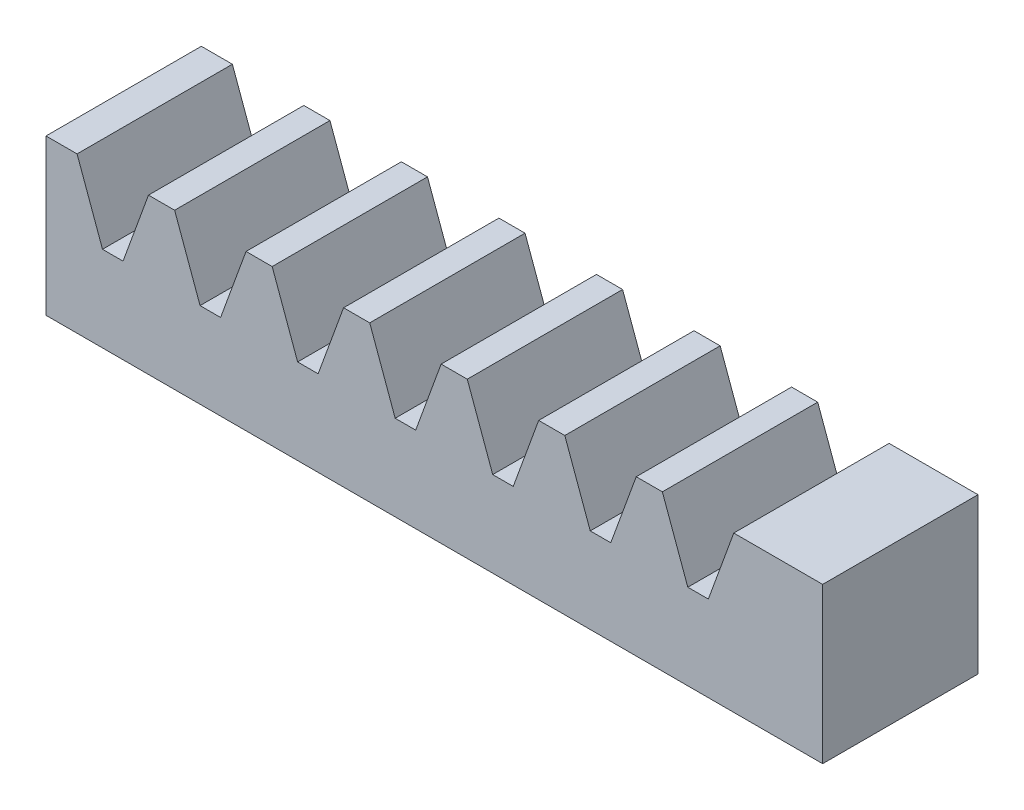
ISO-10303-21;
HEADER;
FILE_DESCRIPTION(('STEP AP214'),'2;1');
FILE_NAME('part.step','',(''),(''),'','','');
FILE_SCHEMA(('AUTOMOTIVE_DESIGN { 1 0 10303 214 1 1 1 1 }'));
ENDSEC;
DATA;
#1=APPLICATION_CONTEXT('core data for automotive mechanical design processes');
#2=APPLICATION_PROTOCOL_DEFINITION('international standard','automotive_design',2000,#1);
#3=PRODUCT_CONTEXT('',#1,'mechanical');
#4=PRODUCT('Part','Part','',(#3));
#5=PRODUCT_RELATED_PRODUCT_CATEGORY('part','',(#4));
#6=PRODUCT_DEFINITION_FORMATION('','',#4);
#7=PRODUCT_DEFINITION_CONTEXT('part definition',#1,'design');
#8=PRODUCT_DEFINITION('design','',#6,#7);
#9=PRODUCT_DEFINITION_SHAPE('','',#8);
#10=(LENGTH_UNIT() NAMED_UNIT(*) SI_UNIT(.MILLI.,.METRE.));
#11=(NAMED_UNIT(*) PLANE_ANGLE_UNIT() SI_UNIT($,.RADIAN.));
#12=(NAMED_UNIT(*) SI_UNIT($,.STERADIAN.) SOLID_ANGLE_UNIT());
#13=UNCERTAINTY_MEASURE_WITH_UNIT(LENGTH_MEASURE(1.E-05),#10,'distance_accuracy_value','');
#14=(GEOMETRIC_REPRESENTATION_CONTEXT(3) GLOBAL_UNCERTAINTY_ASSIGNED_CONTEXT((#13)) GLOBAL_UNIT_ASSIGNED_CONTEXT((#10,
#11,#12)) REPRESENTATION_CONTEXT('',''));
#15=CARTESIAN_POINT('',(0.,0.,0.));
#16=DIRECTION('',(0.,0.,1.));
#17=DIRECTION('',(1.,0.,0.));
#18=AXIS2_PLACEMENT_3D('',#15,#16,#17);
#19=CARTESIAN_POINT('',(0.,10.,10.));
#20=DIRECTION('',(0.,-1.,0.));
#21=DIRECTION('',(0.,0.,-1.));
#22=AXIS2_PLACEMENT_3D('',#19,#20,#21);
#23=PLANE('',#22);
#24=DIRECTION('',(-1.,0.,0.));
#25=VECTOR('',#24,1.);
#26=CARTESIAN_POINT('',(0.,10.,0.));
#27=LINE('',#26,#25);
#28=CARTESIAN_POINT('',(50.,10.,0.));
#29=VERTEX_POINT('',#28);
#30=CARTESIAN_POINT('',(44.2774809370648,10.,0.));
#31=VERTEX_POINT('',#30);
#32=EDGE_CURVE('E280',#29,#31,#27,.T.);
#33=ORIENTED_EDGE('',*,*,#32,.T.);
#34=DIRECTION('',(0.,0.,1.));
#35=VECTOR('',#34,1.);
#36=CARTESIAN_POINT('',(44.2774809370648,10.,0.));
#37=LINE('',#36,#35);
#38=CARTESIAN_POINT('',(44.2774809370648,10.,10.));
#39=VERTEX_POINT('',#38);
#40=EDGE_CURVE('E545',#31,#39,#37,.T.);
#41=ORIENTED_EDGE('',*,*,#40,.T.);
#42=DIRECTION('',(-1.,0.,0.));
#43=VECTOR('',#42,1.);
#44=CARTESIAN_POINT('',(0.,10.,10.));
#45=LINE('',#44,#43);
#46=CARTESIAN_POINT('',(50.,10.,10.));
#47=VERTEX_POINT('',#46);
#48=EDGE_CURVE('E298',#47,#39,#45,.T.);
#49=ORIENTED_EDGE('',*,*,#48,.F.);
#50=DIRECTION('',(0.,0.,-1.));
#51=VECTOR('',#50,1.);
#52=CARTESIAN_POINT('',(50.,10.,10.));
#53=LINE('',#52,#51);
#54=EDGE_CURVE('E297',#47,#29,#53,.T.);
#55=ORIENTED_EDGE('',*,*,#54,.T.);
#56=EDGE_LOOP('',(#33,#41,#49,#55));
#57=FACE_BOUND('',#56,.T.);
#58=ADVANCED_FACE('F43',(#57),#23,.F.);
#59=CARTESIAN_POINT('',(39.68,10.,10.));
#60=VERTEX_POINT('',#59);
#61=CARTESIAN_POINT('',(37.9974809370648,10.,10.));
#62=VERTEX_POINT('',#61);
#63=EDGE_CURVE('E270',#60,#62,#45,.T.);
#64=ORIENTED_EDGE('',*,*,#63,.F.);
#65=DIRECTION('',(0.,0.,1.));
#66=VECTOR('',#65,1.);
#67=CARTESIAN_POINT('',(39.68,10.,0.));
#68=LINE('',#67,#66);
#69=CARTESIAN_POINT('',(39.68,10.,0.));
#70=VERTEX_POINT('',#69);
#71=EDGE_CURVE('E256',#70,#60,#68,.T.);
#72=ORIENTED_EDGE('',*,*,#71,.F.);
#73=CARTESIAN_POINT('',(37.9974809370648,10.,0.));
#74=VERTEX_POINT('',#73);
#75=EDGE_CURVE('E268',#70,#74,#27,.T.);
#76=ORIENTED_EDGE('',*,*,#75,.T.);
#77=DIRECTION('',(0.,0.,1.));
#78=VECTOR('',#77,1.);
#79=CARTESIAN_POINT('',(37.9974809370648,10.,0.));
#80=LINE('',#79,#78);
#81=EDGE_CURVE('E510',#74,#62,#80,.T.);
#82=ORIENTED_EDGE('',*,*,#81,.T.);
#83=EDGE_LOOP('',(#64,#72,#76,#82));
#84=FACE_BOUND('',#83,.T.);
#85=ADVANCED_FACE('F266',(#84),#23,.F.);
#86=CARTESIAN_POINT('',(33.4,10.,10.));
#87=VERTEX_POINT('',#86);
#88=CARTESIAN_POINT('',(31.7174809370648,10.,10.));
#89=VERTEX_POINT('',#88);
#90=EDGE_CURVE('E645',#87,#89,#45,.T.);
#91=ORIENTED_EDGE('',*,*,#90,.F.);
#92=DIRECTION('',(0.,0.,1.));
#93=VECTOR('',#92,1.);
#94=CARTESIAN_POINT('',(33.4,10.,0.));
#95=LINE('',#94,#93);
#96=CARTESIAN_POINT('',(33.4,10.,0.));
#97=VERTEX_POINT('',#96);
#98=EDGE_CURVE('E521',#97,#87,#95,.T.);
#99=ORIENTED_EDGE('',*,*,#98,.F.);
#100=CARTESIAN_POINT('',(31.7174809370648,10.,0.));
#101=VERTEX_POINT('',#100);
#102=EDGE_CURVE('E281',#97,#101,#27,.T.);
#103=ORIENTED_EDGE('',*,*,#102,.T.);
#104=DIRECTION('',(0.,0.,1.));
#105=VECTOR('',#104,1.);
#106=CARTESIAN_POINT('',(31.7174809370648,10.,0.));
#107=LINE('',#106,#105);
#108=EDGE_CURVE('E473',#101,#89,#107,.T.);
#109=ORIENTED_EDGE('',*,*,#108,.T.);
#110=EDGE_LOOP('',(#91,#99,#103,#109));
#111=FACE_BOUND('',#110,.T.);
#112=ADVANCED_FACE('F684',(#111),#23,.F.);
#113=CARTESIAN_POINT('',(27.12,10.,10.));
#114=VERTEX_POINT('',#113);
#115=CARTESIAN_POINT('',(25.4374809370648,10.,10.));
#116=VERTEX_POINT('',#115);
#117=EDGE_CURVE('E642',#114,#116,#45,.T.);
#118=ORIENTED_EDGE('',*,*,#117,.F.);
#119=DIRECTION('',(0.,0.,1.));
#120=VECTOR('',#119,1.);
#121=CARTESIAN_POINT('',(27.12,10.,0.));
#122=LINE('',#121,#120);
#123=CARTESIAN_POINT('',(27.12,10.,0.));
#124=VERTEX_POINT('',#123);
#125=EDGE_CURVE('E484',#124,#114,#122,.T.);
#126=ORIENTED_EDGE('',*,*,#125,.F.);
#127=CARTESIAN_POINT('',(25.4374809370648,10.,0.));
#128=VERTEX_POINT('',#127);
#129=EDGE_CURVE('E288',#124,#128,#27,.T.);
#130=ORIENTED_EDGE('',*,*,#129,.T.);
#131=DIRECTION('',(0.,0.,1.));
#132=VECTOR('',#131,1.);
#133=CARTESIAN_POINT('',(25.4374809370648,10.,0.));
#134=LINE('',#133,#132);
#135=EDGE_CURVE('E436',#128,#116,#134,.T.);
#136=ORIENTED_EDGE('',*,*,#135,.T.);
#137=EDGE_LOOP('',(#118,#126,#130,#136));
#138=FACE_BOUND('',#137,.T.);
#139=ADVANCED_FACE('F628',(#138),#23,.F.);
#140=CARTESIAN_POINT('',(20.84,10.,10.));
#141=VERTEX_POINT('',#140);
#142=CARTESIAN_POINT('',(19.1574809370648,10.,10.));
#143=VERTEX_POINT('',#142);
#144=EDGE_CURVE('E646',#141,#143,#45,.T.);
#145=ORIENTED_EDGE('',*,*,#144,.F.);
#146=DIRECTION('',(0.,0.,1.));
#147=VECTOR('',#146,1.);
#148=CARTESIAN_POINT('',(20.84,10.,0.));
#149=LINE('',#148,#147);
#150=CARTESIAN_POINT('',(20.84,10.,0.));
#151=VERTEX_POINT('',#150);
#152=EDGE_CURVE('E447',#151,#141,#149,.T.);
#153=ORIENTED_EDGE('',*,*,#152,.F.);
#154=CARTESIAN_POINT('',(19.1574809370648,10.,0.));
#155=VERTEX_POINT('',#154);
#156=EDGE_CURVE('E612',#151,#155,#27,.T.);
#157=ORIENTED_EDGE('',*,*,#156,.T.);
#158=DIRECTION('',(0.,0.,1.));
#159=VECTOR('',#158,1.);
#160=CARTESIAN_POINT('',(19.1574809370648,10.,0.));
#161=LINE('',#160,#159);
#162=EDGE_CURVE('E399',#155,#143,#161,.T.);
#163=ORIENTED_EDGE('',*,*,#162,.T.);
#164=EDGE_LOOP('',(#145,#153,#157,#163));
#165=FACE_BOUND('',#164,.T.);
#166=ADVANCED_FACE('F677',(#165),#23,.F.);
#167=CARTESIAN_POINT('',(14.56,10.,10.));
#168=VERTEX_POINT('',#167);
#169=CARTESIAN_POINT('',(12.8774809370648,10.,10.));
#170=VERTEX_POINT('',#169);
#171=EDGE_CURVE('E649',#168,#170,#45,.T.);
#172=ORIENTED_EDGE('',*,*,#171,.F.);
#173=DIRECTION('',(0.,0.,1.));
#174=VECTOR('',#173,1.);
#175=CARTESIAN_POINT('',(14.56,10.,0.));
#176=LINE('',#175,#174);
#177=CARTESIAN_POINT('',(14.56,10.,0.));
#178=VERTEX_POINT('',#177);
#179=EDGE_CURVE('E410',#178,#168,#176,.T.);
#180=ORIENTED_EDGE('',*,*,#179,.F.);
#181=CARTESIAN_POINT('',(12.8774809370648,10.,0.));
#182=VERTEX_POINT('',#181);
#183=EDGE_CURVE('E610',#178,#182,#27,.T.);
#184=ORIENTED_EDGE('',*,*,#183,.T.);
#185=DIRECTION('',(0.,0.,1.));
#186=VECTOR('',#185,1.);
#187=CARTESIAN_POINT('',(12.8774809370648,10.,0.));
#188=LINE('',#187,#186);
#189=EDGE_CURVE('E362',#182,#170,#188,.T.);
#190=ORIENTED_EDGE('',*,*,#189,.T.);
#191=EDGE_LOOP('',(#172,#180,#184,#190));
#192=FACE_BOUND('',#191,.T.);
#193=ADVANCED_FACE('F667',(#192),#23,.F.);
#194=CARTESIAN_POINT('',(8.28,10.,10.));
#195=VERTEX_POINT('',#194);
#196=CARTESIAN_POINT('',(6.59748093706476,10.,10.));
#197=VERTEX_POINT('',#196);
#198=EDGE_CURVE('E608',#195,#197,#45,.T.);
#199=ORIENTED_EDGE('',*,*,#198,.F.);
#200=DIRECTION('',(0.,0.,1.));
#201=VECTOR('',#200,1.);
#202=CARTESIAN_POINT('',(8.28,10.,0.));
#203=LINE('',#202,#201);
#204=CARTESIAN_POINT('',(8.28,10.,0.));
#205=VERTEX_POINT('',#204);
#206=EDGE_CURVE('E373',#205,#195,#203,.T.);
#207=ORIENTED_EDGE('',*,*,#206,.F.);
#208=CARTESIAN_POINT('',(6.59748093706476,10.,0.));
#209=VERTEX_POINT('',#208);
#210=EDGE_CURVE('E317',#205,#209,#27,.T.);
#211=ORIENTED_EDGE('',*,*,#210,.T.);
#212=DIRECTION('',(0.,0.,1.));
#213=VECTOR('',#212,1.);
#214=CARTESIAN_POINT('',(6.59748093706476,10.,0.));
#215=LINE('',#214,#213);
#216=EDGE_CURVE('E321',#209,#197,#215,.T.);
#217=ORIENTED_EDGE('',*,*,#216,.T.);
#218=EDGE_LOOP('',(#199,#207,#211,#217));
#219=FACE_BOUND('',#218,.T.);
#220=ADVANCED_FACE('F606',(#219),#23,.F.);
#221=CARTESIAN_POINT('',(0.,0.,10.));
#222=DIRECTION('',(1.,0.,0.));
#223=DIRECTION('',(0.,0.,-1.));
#224=AXIS2_PLACEMENT_3D('',#221,#222,#223);
#225=PLANE('',#224);
#226=DIRECTION('',(0.,-1.,0.));
#227=VECTOR('',#226,1.);
#228=CARTESIAN_POINT('',(0.,0.,0.));
#229=LINE('',#228,#227);
#230=CARTESIAN_POINT('',(0.,10.,0.));
#231=VERTEX_POINT('',#230);
#232=CARTESIAN_POINT('',(0.,0.,0.));
#233=VERTEX_POINT('',#232);
#234=EDGE_CURVE('E318',#231,#233,#229,.T.);
#235=ORIENTED_EDGE('',*,*,#234,.T.);
#236=DIRECTION('',(0.,0.,-1.));
#237=VECTOR('',#236,1.);
#238=CARTESIAN_POINT('',(0.,0.,10.));
#239=LINE('',#238,#237);
#240=CARTESIAN_POINT('',(0.,0.,10.));
#241=VERTEX_POINT('',#240);
#242=EDGE_CURVE('E11',#241,#233,#239,.T.);
#243=ORIENTED_EDGE('',*,*,#242,.F.);
#244=DIRECTION('',(0.,-1.,0.));
#245=VECTOR('',#244,1.);
#246=CARTESIAN_POINT('',(0.,0.,10.));
#247=LINE('',#246,#245);
#248=CARTESIAN_POINT('',(0.,10.,10.));
#249=VERTEX_POINT('',#248);
#250=EDGE_CURVE('E286',#249,#241,#247,.T.);
#251=ORIENTED_EDGE('',*,*,#250,.F.);
#252=DIRECTION('',(0.,0.,-1.));
#253=VECTOR('',#252,1.);
#254=CARTESIAN_POINT('',(0.,10.,10.));
#255=LINE('',#254,#253);
#256=EDGE_CURVE('E293',#249,#231,#255,.T.);
#257=ORIENTED_EDGE('',*,*,#256,.T.);
#258=EDGE_LOOP('',(#235,#243,#251,#257));
#259=FACE_BOUND('',#258,.T.);
#260=ADVANCED_FACE('F45',(#259),#225,.F.);
#261=CARTESIAN_POINT('',(0.,0.,10.));
#262=DIRECTION('',(0.,1.,0.));
#263=DIRECTION('',(0.,0.,1.));
#264=AXIS2_PLACEMENT_3D('',#261,#262,#263);
#265=PLANE('',#264);
#266=DIRECTION('',(1.,0.,0.));
#267=VECTOR('',#266,1.);
#268=CARTESIAN_POINT('',(0.,0.,0.));
#269=LINE('',#268,#267);
#270=CARTESIAN_POINT('',(50.,0.,0.));
#271=VERTEX_POINT('',#270);
#272=EDGE_CURVE('E313',#233,#271,#269,.T.);
#273=ORIENTED_EDGE('',*,*,#272,.T.);
#274=DIRECTION('',(0.,0.,-1.));
#275=VECTOR('',#274,1.);
#276=CARTESIAN_POINT('',(50.,0.,10.));
#277=LINE('',#276,#275);
#278=CARTESIAN_POINT('',(50.,0.,10.));
#279=VERTEX_POINT('',#278);
#280=EDGE_CURVE('E52',#279,#271,#277,.T.);
#281=ORIENTED_EDGE('',*,*,#280,.F.);
#282=DIRECTION('',(1.,0.,0.));
#283=VECTOR('',#282,1.);
#284=CARTESIAN_POINT('',(0.,0.,10.));
#285=LINE('',#284,#283);
#286=EDGE_CURVE('E330',#241,#279,#285,.T.);
#287=ORIENTED_EDGE('',*,*,#286,.F.);
#288=ORIENTED_EDGE('',*,*,#242,.T.);
#289=EDGE_LOOP('',(#273,#281,#287,#288));
#290=FACE_BOUND('',#289,.T.);
#291=ADVANCED_FACE('F583',(#290),#265,.F.);
#292=CARTESIAN_POINT('',(50.,0.,10.));
#293=DIRECTION('',(-1.,0.,0.));
#294=DIRECTION('',(0.,0.,1.));
#295=AXIS2_PLACEMENT_3D('',#292,#293,#294);
#296=PLANE('',#295);
#297=DIRECTION('',(0.,1.,0.));
#298=VECTOR('',#297,1.);
#299=CARTESIAN_POINT('',(50.,0.,0.));
#300=LINE('',#299,#298);
#301=EDGE_CURVE('E291',#271,#29,#300,.T.);
#302=ORIENTED_EDGE('',*,*,#301,.T.);
#303=ORIENTED_EDGE('',*,*,#54,.F.);
#304=DIRECTION('',(0.,1.,0.));
#305=VECTOR('',#304,1.);
#306=CARTESIAN_POINT('',(50.,0.,10.));
#307=LINE('',#306,#305);
#308=EDGE_CURVE('E309',#279,#47,#307,.T.);
#309=ORIENTED_EDGE('',*,*,#308,.F.);
#310=ORIENTED_EDGE('',*,*,#280,.T.);
#311=EDGE_LOOP('',(#302,#303,#309,#310));
#312=FACE_BOUND('',#311,.T.);
#313=ADVANCED_FACE('F307',(#312),#296,.F.);
#314=CARTESIAN_POINT('',(2.,10.,10.));
#315=VERTEX_POINT('',#314);
#316=EDGE_CURVE('E327',#315,#249,#45,.T.);
#317=ORIENTED_EDGE('',*,*,#316,.F.);
#318=DIRECTION('',(0.,0.,1.));
#319=VECTOR('',#318,1.);
#320=CARTESIAN_POINT('',(2.,10.,0.));
#321=LINE('',#320,#319);
#322=CARTESIAN_POINT('',(2.,10.,0.));
#323=VERTEX_POINT('',#322);
#324=EDGE_CURVE('E336',#323,#315,#321,.T.);
#325=ORIENTED_EDGE('',*,*,#324,.F.);
#326=EDGE_CURVE('E287',#323,#231,#27,.T.);
#327=ORIENTED_EDGE('',*,*,#326,.T.);
#328=ORIENTED_EDGE('',*,*,#256,.F.);
#329=EDGE_LOOP('',(#317,#325,#327,#328));
#330=FACE_BOUND('',#329,.T.);
#331=ADVANCED_FACE('F590',(#330),#23,.F.);
#332=CARTESIAN_POINT('',(0.,0.,10.));
#333=DIRECTION('',(0.,0.,-1.));
#334=DIRECTION('',(-1.,0.,0.));
#335=AXIS2_PLACEMENT_3D('',#332,#333,#334);
#336=PLANE('',#335);
#337=ORIENTED_EDGE('',*,*,#48,.T.);
#338=DIRECTION('',(0.342020143325665,0.93969262078591,0.));
#339=VECTOR('',#338,1.);
#340=CARTESIAN_POINT('',(42.6396148828669,5.5,10.));
#341=LINE('',#340,#339);
#342=CARTESIAN_POINT('',(42.6396148828669,5.5,10.));
#343=VERTEX_POINT('',#342);
#344=EDGE_CURVE('E262',#343,#39,#341,.T.);
#345=ORIENTED_EDGE('',*,*,#344,.F.);
#346=DIRECTION('',(1.,0.,0.));
#347=VECTOR('',#346,1.);
#348=CARTESIAN_POINT('',(41.3178660541979,5.5,10.));
#349=LINE('',#348,#347);
#350=CARTESIAN_POINT('',(41.3178660541979,5.5,10.));
#351=VERTEX_POINT('',#350);
#352=EDGE_CURVE('E563',#351,#343,#349,.T.);
#353=ORIENTED_EDGE('',*,*,#352,.F.);
#354=DIRECTION('',(0.342020143325669,-0.939692620785908,0.));
#355=VECTOR('',#354,1.);
#356=CARTESIAN_POINT('',(39.68,10.,10.));
#357=LINE('',#356,#355);
#358=EDGE_CURVE('E567',#60,#351,#357,.T.);
#359=ORIENTED_EDGE('',*,*,#358,.F.);
#360=ORIENTED_EDGE('',*,*,#63,.T.);
#361=DIRECTION('',(0.342020143325665,0.93969262078591,0.));
#362=VECTOR('',#361,1.);
#363=CARTESIAN_POINT('',(36.3596148828669,5.5,10.));
#364=LINE('',#363,#362);
#365=CARTESIAN_POINT('',(36.3596148828669,5.5,10.));
#366=VERTEX_POINT('',#365);
#367=EDGE_CURVE('E532',#366,#62,#364,.T.);
#368=ORIENTED_EDGE('',*,*,#367,.F.);
#369=DIRECTION('',(1.,0.,0.));
#370=VECTOR('',#369,1.);
#371=CARTESIAN_POINT('',(35.0378660541979,5.5,10.));
#372=LINE('',#371,#370);
#373=CARTESIAN_POINT('',(35.0378660541979,5.5,10.));
#374=VERTEX_POINT('',#373);
#375=EDGE_CURVE('E537',#374,#366,#372,.T.);
#376=ORIENTED_EDGE('',*,*,#375,.F.);
#377=DIRECTION('',(0.342020143325669,-0.939692620785908,0.));
#378=VECTOR('',#377,1.);
#379=CARTESIAN_POINT('',(33.4,10.,10.));
#380=LINE('',#379,#378);
#381=EDGE_CURVE('E541',#87,#374,#380,.T.);
#382=ORIENTED_EDGE('',*,*,#381,.F.);
#383=ORIENTED_EDGE('',*,*,#90,.T.);
#384=DIRECTION('',(0.342020143325665,0.93969262078591,0.));
#385=VECTOR('',#384,1.);
#386=CARTESIAN_POINT('',(30.0796148828669,5.5,10.));
#387=LINE('',#386,#385);
#388=CARTESIAN_POINT('',(30.0796148828669,5.5,10.));
#389=VERTEX_POINT('',#388);
#390=EDGE_CURVE('E497',#389,#89,#387,.T.);
#391=ORIENTED_EDGE('',*,*,#390,.F.);
#392=DIRECTION('',(1.,0.,0.));
#393=VECTOR('',#392,1.);
#394=CARTESIAN_POINT('',(28.7578660541979,5.5,10.));
#395=LINE('',#394,#393);
#396=CARTESIAN_POINT('',(28.7578660541979,5.5,10.));
#397=VERTEX_POINT('',#396);
#398=EDGE_CURVE('E502',#397,#389,#395,.T.);
#399=ORIENTED_EDGE('',*,*,#398,.F.);
#400=DIRECTION('',(0.342020143325669,-0.939692620785908,0.));
#401=VECTOR('',#400,1.);
#402=CARTESIAN_POINT('',(27.12,10.,10.));
#403=LINE('',#402,#401);
#404=EDGE_CURVE('E506',#114,#397,#403,.T.);
#405=ORIENTED_EDGE('',*,*,#404,.F.);
#406=ORIENTED_EDGE('',*,*,#117,.T.);
#407=DIRECTION('',(0.342020143325665,0.93969262078591,0.));
#408=VECTOR('',#407,1.);
#409=CARTESIAN_POINT('',(23.7996148828669,5.5,10.));
#410=LINE('',#409,#408);
#411=CARTESIAN_POINT('',(23.7996148828669,5.5,10.));
#412=VERTEX_POINT('',#411);
#413=EDGE_CURVE('E460',#412,#116,#410,.T.);
#414=ORIENTED_EDGE('',*,*,#413,.F.);
#415=DIRECTION('',(1.,0.,0.));
#416=VECTOR('',#415,1.);
#417=CARTESIAN_POINT('',(22.4778660541979,5.5,10.));
#418=LINE('',#417,#416);
#419=CARTESIAN_POINT('',(22.4778660541979,5.5,10.));
#420=VERTEX_POINT('',#419);
#421=EDGE_CURVE('E465',#420,#412,#418,.T.);
#422=ORIENTED_EDGE('',*,*,#421,.F.);
#423=DIRECTION('',(0.342020143325669,-0.939692620785908,0.));
#424=VECTOR('',#423,1.);
#425=CARTESIAN_POINT('',(20.84,10.,10.));
#426=LINE('',#425,#424);
#427=EDGE_CURVE('E469',#141,#420,#426,.T.);
#428=ORIENTED_EDGE('',*,*,#427,.F.);
#429=ORIENTED_EDGE('',*,*,#144,.T.);
#430=DIRECTION('',(0.342020143325665,0.93969262078591,0.));
#431=VECTOR('',#430,1.);
#432=CARTESIAN_POINT('',(17.5196148828669,5.5,10.));
#433=LINE('',#432,#431);
#434=CARTESIAN_POINT('',(17.5196148828669,5.5,10.));
#435=VERTEX_POINT('',#434);
#436=EDGE_CURVE('E423',#435,#143,#433,.T.);
#437=ORIENTED_EDGE('',*,*,#436,.F.);
#438=DIRECTION('',(1.,0.,0.));
#439=VECTOR('',#438,1.);
#440=CARTESIAN_POINT('',(16.1978660541979,5.5,10.));
#441=LINE('',#440,#439);
#442=CARTESIAN_POINT('',(16.1978660541979,5.5,10.));
#443=VERTEX_POINT('',#442);
#444=EDGE_CURVE('E428',#443,#435,#441,.T.);
#445=ORIENTED_EDGE('',*,*,#444,.F.);
#446=DIRECTION('',(0.342020143325669,-0.939692620785908,0.));
#447=VECTOR('',#446,1.);
#448=CARTESIAN_POINT('',(14.56,10.,10.));
#449=LINE('',#448,#447);
#450=EDGE_CURVE('E432',#168,#443,#449,.T.);
#451=ORIENTED_EDGE('',*,*,#450,.F.);
#452=ORIENTED_EDGE('',*,*,#171,.T.);
#453=DIRECTION('',(0.342020143325665,0.93969262078591,0.));
#454=VECTOR('',#453,1.);
#455=CARTESIAN_POINT('',(11.2396148828669,5.5,10.));
#456=LINE('',#455,#454);
#457=CARTESIAN_POINT('',(11.2396148828669,5.5,10.));
#458=VERTEX_POINT('',#457);
#459=EDGE_CURVE('E386',#458,#170,#456,.T.);
#460=ORIENTED_EDGE('',*,*,#459,.F.);
#461=DIRECTION('',(1.,0.,0.));
#462=VECTOR('',#461,1.);
#463=CARTESIAN_POINT('',(9.91786605419792,5.5,10.));
#464=LINE('',#463,#462);
#465=CARTESIAN_POINT('',(9.91786605419792,5.5,10.));
#466=VERTEX_POINT('',#465);
#467=EDGE_CURVE('E391',#466,#458,#464,.T.);
#468=ORIENTED_EDGE('',*,*,#467,.F.);
#469=DIRECTION('',(0.342020143325669,-0.939692620785908,0.));
#470=VECTOR('',#469,1.);
#471=CARTESIAN_POINT('',(8.28,10.,10.));
#472=LINE('',#471,#470);
#473=EDGE_CURVE('E395',#195,#466,#472,.T.);
#474=ORIENTED_EDGE('',*,*,#473,.F.);
#475=ORIENTED_EDGE('',*,*,#198,.T.);
#476=DIRECTION('',(0.342020143325665,0.93969262078591,0.));
#477=VECTOR('',#476,1.);
#478=CARTESIAN_POINT('',(4.95961488286687,5.5,10.));
#479=LINE('',#478,#477);
#480=CARTESIAN_POINT('',(4.95961488286687,5.5,10.));
#481=VERTEX_POINT('',#480);
#482=EDGE_CURVE('E349',#481,#197,#479,.T.);
#483=ORIENTED_EDGE('',*,*,#482,.F.);
#484=DIRECTION('',(1.,0.,0.));
#485=VECTOR('',#484,1.);
#486=CARTESIAN_POINT('',(3.63786605419792,5.5,10.));
#487=LINE('',#486,#485);
#488=CARTESIAN_POINT('',(3.63786605419792,5.5,10.));
#489=VERTEX_POINT('',#488);
#490=EDGE_CURVE('E354',#489,#481,#487,.T.);
#491=ORIENTED_EDGE('',*,*,#490,.F.);
#492=DIRECTION('',(0.342020143325669,-0.939692620785908,0.));
#493=VECTOR('',#492,1.);
#494=CARTESIAN_POINT('',(2.,10.,10.));
#495=LINE('',#494,#493);
#496=EDGE_CURVE('E358',#315,#489,#495,.T.);
#497=ORIENTED_EDGE('',*,*,#496,.F.);
#498=ORIENTED_EDGE('',*,*,#316,.T.);
#499=ORIENTED_EDGE('',*,*,#250,.T.);
#500=ORIENTED_EDGE('',*,*,#286,.T.);
#501=ORIENTED_EDGE('',*,*,#308,.T.);
#502=EDGE_LOOP('',(#337,#345,#353,#359,#360,#368,#376,#382,#383,#391,#399,#405,#406,#414,#422,
#428,#429,#437,#445,#451,#452,#460,#468,#474,#475,#483,#491,#497,#498,#499,#500,#501));
#503=FACE_BOUND('',#502,.T.);
#504=ADVANCED_FACE('F579',(#503),#336,.F.);
#505=CARTESIAN_POINT('',(0.,0.,0.));
#506=DIRECTION('',(0.,0.,-1.));
#507=DIRECTION('',(-1.,0.,0.));
#508=AXIS2_PLACEMENT_3D('',#505,#506,#507);
#509=PLANE('',#508);
#510=DIRECTION('',(0.342020143325665,0.93969262078591,0.));
#511=VECTOR('',#510,1.);
#512=CARTESIAN_POINT('',(42.6396148828669,5.5,0.));
#513=LINE('',#512,#511);
#514=CARTESIAN_POINT('',(42.6396148828669,5.5,0.));
#515=VERTEX_POINT('',#514);
#516=EDGE_CURVE('E272',#515,#31,#513,.T.);
#517=ORIENTED_EDGE('',*,*,#516,.T.);
#518=ORIENTED_EDGE('',*,*,#32,.F.);
#519=ORIENTED_EDGE('',*,*,#301,.F.);
#520=ORIENTED_EDGE('',*,*,#272,.F.);
#521=ORIENTED_EDGE('',*,*,#234,.F.);
#522=ORIENTED_EDGE('',*,*,#326,.F.);
#523=DIRECTION('',(0.342020143325669,-0.939692620785908,0.));
#524=VECTOR('',#523,1.);
#525=CARTESIAN_POINT('',(2.,10.,0.));
#526=LINE('',#525,#524);
#527=CARTESIAN_POINT('',(3.63786605419792,5.5,0.));
#528=VERTEX_POINT('',#527);
#529=EDGE_CURVE('E353',#323,#528,#526,.T.);
#530=ORIENTED_EDGE('',*,*,#529,.T.);
#531=DIRECTION('',(1.,0.,0.));
#532=VECTOR('',#531,1.);
#533=CARTESIAN_POINT('',(3.63786605419792,5.5,0.));
#534=LINE('',#533,#532);
#535=CARTESIAN_POINT('',(4.95961488286687,5.5,0.));
#536=VERTEX_POINT('',#535);
#537=EDGE_CURVE('E366',#528,#536,#534,.T.);
#538=ORIENTED_EDGE('',*,*,#537,.T.);
#539=DIRECTION('',(0.342020143325665,0.93969262078591,0.));
#540=VECTOR('',#539,1.);
#541=CARTESIAN_POINT('',(4.95961488286687,5.5,0.));
#542=LINE('',#541,#540);
#543=EDGE_CURVE('E340',#536,#209,#542,.T.);
#544=ORIENTED_EDGE('',*,*,#543,.T.);
#545=ORIENTED_EDGE('',*,*,#210,.F.);
#546=DIRECTION('',(0.342020143325669,-0.939692620785908,0.));
#547=VECTOR('',#546,1.);
#548=CARTESIAN_POINT('',(8.28,10.,0.));
#549=LINE('',#548,#547);
#550=CARTESIAN_POINT('',(9.91786605419792,5.5,0.));
#551=VERTEX_POINT('',#550);
#552=EDGE_CURVE('E390',#205,#551,#549,.T.);
#553=ORIENTED_EDGE('',*,*,#552,.T.);
#554=DIRECTION('',(1.,0.,0.));
#555=VECTOR('',#554,1.);
#556=CARTESIAN_POINT('',(9.91786605419792,5.5,0.));
#557=LINE('',#556,#555);
#558=CARTESIAN_POINT('',(11.2396148828669,5.5,0.));
#559=VERTEX_POINT('',#558);
#560=EDGE_CURVE('E403',#551,#559,#557,.T.);
#561=ORIENTED_EDGE('',*,*,#560,.T.);
#562=DIRECTION('',(0.342020143325665,0.93969262078591,0.));
#563=VECTOR('',#562,1.);
#564=CARTESIAN_POINT('',(11.2396148828669,5.5,0.));
#565=LINE('',#564,#563);
#566=EDGE_CURVE('E377',#559,#182,#565,.T.);
#567=ORIENTED_EDGE('',*,*,#566,.T.);
#568=ORIENTED_EDGE('',*,*,#183,.F.);
#569=DIRECTION('',(0.342020143325669,-0.939692620785908,0.));
#570=VECTOR('',#569,1.);
#571=CARTESIAN_POINT('',(14.56,10.,0.));
#572=LINE('',#571,#570);
#573=CARTESIAN_POINT('',(16.1978660541979,5.5,0.));
#574=VERTEX_POINT('',#573);
#575=EDGE_CURVE('E427',#178,#574,#572,.T.);
#576=ORIENTED_EDGE('',*,*,#575,.T.);
#577=DIRECTION('',(1.,0.,0.));
#578=VECTOR('',#577,1.);
#579=CARTESIAN_POINT('',(16.1978660541979,5.5,0.));
#580=LINE('',#579,#578);
#581=CARTESIAN_POINT('',(17.5196148828669,5.5,0.));
#582=VERTEX_POINT('',#581);
#583=EDGE_CURVE('E440',#574,#582,#580,.T.);
#584=ORIENTED_EDGE('',*,*,#583,.T.);
#585=DIRECTION('',(0.342020143325665,0.93969262078591,0.));
#586=VECTOR('',#585,1.);
#587=CARTESIAN_POINT('',(17.5196148828669,5.5,0.));
#588=LINE('',#587,#586);
#589=EDGE_CURVE('E414',#582,#155,#588,.T.);
#590=ORIENTED_EDGE('',*,*,#589,.T.);
#591=ORIENTED_EDGE('',*,*,#156,.F.);
#592=DIRECTION('',(0.342020143325669,-0.939692620785908,0.));
#593=VECTOR('',#592,1.);
#594=CARTESIAN_POINT('',(20.84,10.,0.));
#595=LINE('',#594,#593);
#596=CARTESIAN_POINT('',(22.4778660541979,5.5,0.));
#597=VERTEX_POINT('',#596);
#598=EDGE_CURVE('E464',#151,#597,#595,.T.);
#599=ORIENTED_EDGE('',*,*,#598,.T.);
#600=DIRECTION('',(1.,0.,0.));
#601=VECTOR('',#600,1.);
#602=CARTESIAN_POINT('',(22.4778660541979,5.5,0.));
#603=LINE('',#602,#601);
#604=CARTESIAN_POINT('',(23.7996148828669,5.5,0.));
#605=VERTEX_POINT('',#604);
#606=EDGE_CURVE('E477',#597,#605,#603,.T.);
#607=ORIENTED_EDGE('',*,*,#606,.T.);
#608=DIRECTION('',(0.342020143325665,0.93969262078591,0.));
#609=VECTOR('',#608,1.);
#610=CARTESIAN_POINT('',(23.7996148828669,5.5,0.));
#611=LINE('',#610,#609);
#612=EDGE_CURVE('E451',#605,#128,#611,.T.);
#613=ORIENTED_EDGE('',*,*,#612,.T.);
#614=ORIENTED_EDGE('',*,*,#129,.F.);
#615=DIRECTION('',(0.342020143325669,-0.939692620785908,0.));
#616=VECTOR('',#615,1.);
#617=CARTESIAN_POINT('',(27.12,10.,0.));
#618=LINE('',#617,#616);
#619=CARTESIAN_POINT('',(28.7578660541979,5.5,0.));
#620=VERTEX_POINT('',#619);
#621=EDGE_CURVE('E501',#124,#620,#618,.T.);
#622=ORIENTED_EDGE('',*,*,#621,.T.);
#623=DIRECTION('',(1.,0.,0.));
#624=VECTOR('',#623,1.);
#625=CARTESIAN_POINT('',(28.7578660541979,5.5,0.));
#626=LINE('',#625,#624);
#627=CARTESIAN_POINT('',(30.0796148828669,5.5,0.));
#628=VERTEX_POINT('',#627);
#629=EDGE_CURVE('E514',#620,#628,#626,.T.);
#630=ORIENTED_EDGE('',*,*,#629,.T.);
#631=DIRECTION('',(0.342020143325665,0.93969262078591,0.));
#632=VECTOR('',#631,1.);
#633=CARTESIAN_POINT('',(30.0796148828669,5.5,0.));
#634=LINE('',#633,#632);
#635=EDGE_CURVE('E488',#628,#101,#634,.T.);
#636=ORIENTED_EDGE('',*,*,#635,.T.);
#637=ORIENTED_EDGE('',*,*,#102,.F.);
#638=DIRECTION('',(0.342020143325669,-0.939692620785908,0.));
#639=VECTOR('',#638,1.);
#640=CARTESIAN_POINT('',(33.4,10.,0.));
#641=LINE('',#640,#639);
#642=CARTESIAN_POINT('',(35.0378660541979,5.5,0.));
#643=VERTEX_POINT('',#642);
#644=EDGE_CURVE('E536',#97,#643,#641,.T.);
#645=ORIENTED_EDGE('',*,*,#644,.T.);
#646=DIRECTION('',(1.,0.,0.));
#647=VECTOR('',#646,1.);
#648=CARTESIAN_POINT('',(35.0378660541979,5.5,0.));
#649=LINE('',#648,#647);
#650=CARTESIAN_POINT('',(36.3596148828669,5.5,0.));
#651=VERTEX_POINT('',#650);
#652=EDGE_CURVE('E67',#643,#651,#649,.T.);
#653=ORIENTED_EDGE('',*,*,#652,.T.);
#654=DIRECTION('',(0.342020143325665,0.93969262078591,0.));
#655=VECTOR('',#654,1.);
#656=CARTESIAN_POINT('',(36.3596148828669,5.5,0.));
#657=LINE('',#656,#655);
#658=EDGE_CURVE('E278',#651,#74,#657,.T.);
#659=ORIENTED_EDGE('',*,*,#658,.T.);
#660=ORIENTED_EDGE('',*,*,#75,.F.);
#661=DIRECTION('',(0.342020143325669,-0.939692620785908,0.));
#662=VECTOR('',#661,1.);
#663=CARTESIAN_POINT('',(39.68,10.,0.));
#664=LINE('',#663,#662);
#665=CARTESIAN_POINT('',(41.3178660541979,5.5,0.));
#666=VERTEX_POINT('',#665);
#667=EDGE_CURVE('E252',#70,#666,#664,.T.);
#668=ORIENTED_EDGE('',*,*,#667,.T.);
#669=DIRECTION('',(1.,0.,0.));
#670=VECTOR('',#669,1.);
#671=CARTESIAN_POINT('',(41.3178660541979,5.5,0.));
#672=LINE('',#671,#670);
#673=EDGE_CURVE('E59',#666,#515,#672,.T.);
#674=ORIENTED_EDGE('',*,*,#673,.T.);
#675=EDGE_LOOP('',(#517,#518,#519,#520,#521,#522,#530,#538,#544,#545,#553,#561,#567,#568,#576,
#584,#590,#591,#599,#607,#613,#614,#622,#630,#636,#637,#645,#653,#659,#660,#668,#674));
#676=FACE_BOUND('',#675,.T.);
#677=ADVANCED_FACE('F276',(#676),#509,.T.);
#678=CARTESIAN_POINT('',(4.95961488286687,5.5,0.));
#679=DIRECTION('',(0.93969262078591,-0.342020143325665,0.));
#680=DIRECTION('',(0.342020143325665,0.93969262078591,0.));
#681=AXIS2_PLACEMENT_3D('',#678,#679,#680);
#682=PLANE('',#681);
#683=ORIENTED_EDGE('',*,*,#482,.T.);
#684=ORIENTED_EDGE('',*,*,#216,.F.);
#685=ORIENTED_EDGE('',*,*,#543,.F.);
#686=DIRECTION('',(0.,0.,1.));
#687=VECTOR('',#686,1.);
#688=CARTESIAN_POINT('',(4.95961488286687,5.5,0.));
#689=LINE('',#688,#687);
#690=EDGE_CURVE('E343',#536,#481,#689,.T.);
#691=ORIENTED_EDGE('',*,*,#690,.T.);
#692=EDGE_LOOP('',(#683,#684,#685,#691));
#693=FACE_BOUND('',#692,.T.);
#694=ADVANCED_FACE('F603',(#693),#682,.F.);
#695=CARTESIAN_POINT('',(3.63786605419792,5.5,0.));
#696=DIRECTION('',(0.,-1.,0.));
#697=DIRECTION('',(0.,0.,-1.));
#698=AXIS2_PLACEMENT_3D('',#695,#696,#697);
#699=PLANE('',#698);
#700=ORIENTED_EDGE('',*,*,#490,.T.);
#701=ORIENTED_EDGE('',*,*,#690,.F.);
#702=ORIENTED_EDGE('',*,*,#537,.F.);
#703=DIRECTION('',(0.,0.,1.));
#704=VECTOR('',#703,1.);
#705=CARTESIAN_POINT('',(3.63786605419792,5.5,0.));
#706=LINE('',#705,#704);
#707=EDGE_CURVE('E339',#528,#489,#706,.T.);
#708=ORIENTED_EDGE('',*,*,#707,.T.);
#709=EDGE_LOOP('',(#700,#701,#702,#708));
#710=FACE_BOUND('',#709,.T.);
#711=ADVANCED_FACE('F598',(#710),#699,.F.);
#712=CARTESIAN_POINT('',(2.,10.,0.));
#713=DIRECTION('',(-0.939692620785908,-0.342020143325669,0.));
#714=DIRECTION('',(0.342020143325669,-0.939692620785908,0.));
#715=AXIS2_PLACEMENT_3D('',#712,#713,#714);
#716=PLANE('',#715);
#717=ORIENTED_EDGE('',*,*,#496,.T.);
#718=ORIENTED_EDGE('',*,*,#707,.F.);
#719=ORIENTED_EDGE('',*,*,#529,.F.);
#720=ORIENTED_EDGE('',*,*,#324,.T.);
#721=EDGE_LOOP('',(#717,#718,#719,#720));
#722=FACE_BOUND('',#721,.T.);
#723=ADVANCED_FACE('F593',(#722),#716,.F.);
#724=CARTESIAN_POINT('',(11.2396148828669,5.5,0.));
#725=DIRECTION('',(0.93969262078591,-0.342020143325665,0.));
#726=DIRECTION('',(0.342020143325665,0.93969262078591,0.));
#727=AXIS2_PLACEMENT_3D('',#724,#725,#726);
#728=PLANE('',#727);
#729=ORIENTED_EDGE('',*,*,#459,.T.);
#730=ORIENTED_EDGE('',*,*,#189,.F.);
#731=ORIENTED_EDGE('',*,*,#566,.F.);
#732=DIRECTION('',(0.,0.,1.));
#733=VECTOR('',#732,1.);
#734=CARTESIAN_POINT('',(11.2396148828669,5.5,0.));
#735=LINE('',#734,#733);
#736=EDGE_CURVE('E380',#559,#458,#735,.T.);
#737=ORIENTED_EDGE('',*,*,#736,.T.);
#738=EDGE_LOOP('',(#729,#730,#731,#737));
#739=FACE_BOUND('',#738,.T.);
#740=ADVANCED_FACE('F666',(#739),#728,.F.);
#741=CARTESIAN_POINT('',(9.91786605419792,5.5,0.));
#742=DIRECTION('',(0.,-1.,0.));
#743=DIRECTION('',(0.,0.,-1.));
#744=AXIS2_PLACEMENT_3D('',#741,#742,#743);
#745=PLANE('',#744);
#746=ORIENTED_EDGE('',*,*,#467,.T.);
#747=ORIENTED_EDGE('',*,*,#736,.F.);
#748=ORIENTED_EDGE('',*,*,#560,.F.);
#749=DIRECTION('',(0.,0.,1.));
#750=VECTOR('',#749,1.);
#751=CARTESIAN_POINT('',(9.91786605419792,5.5,0.));
#752=LINE('',#751,#750);
#753=EDGE_CURVE('E376',#551,#466,#752,.T.);
#754=ORIENTED_EDGE('',*,*,#753,.T.);
#755=EDGE_LOOP('',(#746,#747,#748,#754));
#756=FACE_BOUND('',#755,.T.);
#757=ADVANCED_FACE('F664',(#756),#745,.F.);
#758=CARTESIAN_POINT('',(8.28,10.,0.));
#759=DIRECTION('',(-0.939692620785908,-0.342020143325669,0.));
#760=DIRECTION('',(0.342020143325669,-0.939692620785908,0.));
#761=AXIS2_PLACEMENT_3D('',#758,#759,#760);
#762=PLANE('',#761);
#763=ORIENTED_EDGE('',*,*,#473,.T.);
#764=ORIENTED_EDGE('',*,*,#753,.F.);
#765=ORIENTED_EDGE('',*,*,#552,.F.);
#766=ORIENTED_EDGE('',*,*,#206,.T.);
#767=EDGE_LOOP('',(#763,#764,#765,#766));
#768=FACE_BOUND('',#767,.T.);
#769=ADVANCED_FACE('F661',(#768),#762,.F.);
#770=CARTESIAN_POINT('',(17.5196148828669,5.5,0.));
#771=DIRECTION('',(0.93969262078591,-0.342020143325665,0.));
#772=DIRECTION('',(0.342020143325665,0.93969262078591,0.));
#773=AXIS2_PLACEMENT_3D('',#770,#771,#772);
#774=PLANE('',#773);
#775=ORIENTED_EDGE('',*,*,#436,.T.);
#776=ORIENTED_EDGE('',*,*,#162,.F.);
#777=ORIENTED_EDGE('',*,*,#589,.F.);
#778=DIRECTION('',(0.,0.,1.));
#779=VECTOR('',#778,1.);
#780=CARTESIAN_POINT('',(17.5196148828669,5.5,0.));
#781=LINE('',#780,#779);
#782=EDGE_CURVE('E417',#582,#435,#781,.T.);
#783=ORIENTED_EDGE('',*,*,#782,.T.);
#784=EDGE_LOOP('',(#775,#776,#777,#783));
#785=FACE_BOUND('',#784,.T.);
#786=ADVANCED_FACE('F676',(#785),#774,.F.);
#787=CARTESIAN_POINT('',(16.1978660541979,5.5,0.));
#788=DIRECTION('',(0.,-1.,0.));
#789=DIRECTION('',(0.,0.,-1.));
#790=AXIS2_PLACEMENT_3D('',#787,#788,#789);
#791=PLANE('',#790);
#792=ORIENTED_EDGE('',*,*,#444,.T.);
#793=ORIENTED_EDGE('',*,*,#782,.F.);
#794=ORIENTED_EDGE('',*,*,#583,.F.);
#795=DIRECTION('',(0.,0.,1.));
#796=VECTOR('',#795,1.);
#797=CARTESIAN_POINT('',(16.1978660541979,5.5,0.));
#798=LINE('',#797,#796);
#799=EDGE_CURVE('E413',#574,#443,#798,.T.);
#800=ORIENTED_EDGE('',*,*,#799,.T.);
#801=EDGE_LOOP('',(#792,#793,#794,#800));
#802=FACE_BOUND('',#801,.T.);
#803=ADVANCED_FACE('F673',(#802),#791,.F.);
#804=CARTESIAN_POINT('',(14.56,10.,0.));
#805=DIRECTION('',(-0.939692620785908,-0.342020143325669,0.));
#806=DIRECTION('',(0.342020143325669,-0.939692620785908,0.));
#807=AXIS2_PLACEMENT_3D('',#804,#805,#806);
#808=PLANE('',#807);
#809=ORIENTED_EDGE('',*,*,#450,.T.);
#810=ORIENTED_EDGE('',*,*,#799,.F.);
#811=ORIENTED_EDGE('',*,*,#575,.F.);
#812=ORIENTED_EDGE('',*,*,#179,.T.);
#813=EDGE_LOOP('',(#809,#810,#811,#812));
#814=FACE_BOUND('',#813,.T.);
#815=ADVANCED_FACE('F670',(#814),#808,.F.);
#816=CARTESIAN_POINT('',(23.7996148828669,5.5,0.));
#817=DIRECTION('',(0.93969262078591,-0.342020143325665,0.));
#818=DIRECTION('',(0.342020143325665,0.93969262078591,0.));
#819=AXIS2_PLACEMENT_3D('',#816,#817,#818);
#820=PLANE('',#819);
#821=ORIENTED_EDGE('',*,*,#413,.T.);
#822=ORIENTED_EDGE('',*,*,#135,.F.);
#823=ORIENTED_EDGE('',*,*,#612,.F.);
#824=DIRECTION('',(0.,0.,1.));
#825=VECTOR('',#824,1.);
#826=CARTESIAN_POINT('',(23.7996148828669,5.5,0.));
#827=LINE('',#826,#825);
#828=EDGE_CURVE('E454',#605,#412,#827,.T.);
#829=ORIENTED_EDGE('',*,*,#828,.T.);
#830=EDGE_LOOP('',(#821,#822,#823,#829));
#831=FACE_BOUND('',#830,.T.);
#832=ADVANCED_FACE('F631',(#831),#820,.F.);
#833=CARTESIAN_POINT('',(22.4778660541979,5.5,0.));
#834=DIRECTION('',(0.,-1.,0.));
#835=DIRECTION('',(0.,0.,-1.));
#836=AXIS2_PLACEMENT_3D('',#833,#834,#835);
#837=PLANE('',#836);
#838=ORIENTED_EDGE('',*,*,#421,.T.);
#839=ORIENTED_EDGE('',*,*,#828,.F.);
#840=ORIENTED_EDGE('',*,*,#606,.F.);
#841=DIRECTION('',(0.,0.,1.));
#842=VECTOR('',#841,1.);
#843=CARTESIAN_POINT('',(22.4778660541979,5.5,0.));
#844=LINE('',#843,#842);
#845=EDGE_CURVE('E450',#597,#420,#844,.T.);
#846=ORIENTED_EDGE('',*,*,#845,.T.);
#847=EDGE_LOOP('',(#838,#839,#840,#846));
#848=FACE_BOUND('',#847,.T.);
#849=ADVANCED_FACE('F635',(#848),#837,.F.);
#850=CARTESIAN_POINT('',(20.84,10.,0.));
#851=DIRECTION('',(-0.939692620785908,-0.342020143325669,0.));
#852=DIRECTION('',(0.342020143325669,-0.939692620785908,0.));
#853=AXIS2_PLACEMENT_3D('',#850,#851,#852);
#854=PLANE('',#853);
#855=ORIENTED_EDGE('',*,*,#427,.T.);
#856=ORIENTED_EDGE('',*,*,#845,.F.);
#857=ORIENTED_EDGE('',*,*,#598,.F.);
#858=ORIENTED_EDGE('',*,*,#152,.T.);
#859=EDGE_LOOP('',(#855,#856,#857,#858));
#860=FACE_BOUND('',#859,.T.);
#861=ADVANCED_FACE('F637',(#860),#854,.F.);
#862=CARTESIAN_POINT('',(30.0796148828669,5.5,0.));
#863=DIRECTION('',(0.93969262078591,-0.342020143325665,0.));
#864=DIRECTION('',(0.342020143325665,0.93969262078591,0.));
#865=AXIS2_PLACEMENT_3D('',#862,#863,#864);
#866=PLANE('',#865);
#867=ORIENTED_EDGE('',*,*,#390,.T.);
#868=ORIENTED_EDGE('',*,*,#108,.F.);
#869=ORIENTED_EDGE('',*,*,#635,.F.);
#870=DIRECTION('',(0.,0.,1.));
#871=VECTOR('',#870,1.);
#872=CARTESIAN_POINT('',(30.0796148828669,5.5,0.));
#873=LINE('',#872,#871);
#874=EDGE_CURVE('E491',#628,#389,#873,.T.);
#875=ORIENTED_EDGE('',*,*,#874,.T.);
#876=EDGE_LOOP('',(#867,#868,#869,#875));
#877=FACE_BOUND('',#876,.T.);
#878=ADVANCED_FACE('F880',(#877),#866,.F.);
#879=CARTESIAN_POINT('',(28.7578660541979,5.5,0.));
#880=DIRECTION('',(0.,-1.,0.));
#881=DIRECTION('',(0.,0.,-1.));
#882=AXIS2_PLACEMENT_3D('',#879,#880,#881);
#883=PLANE('',#882);
#884=ORIENTED_EDGE('',*,*,#398,.T.);
#885=ORIENTED_EDGE('',*,*,#874,.F.);
#886=ORIENTED_EDGE('',*,*,#629,.F.);
#887=DIRECTION('',(0.,0.,1.));
#888=VECTOR('',#887,1.);
#889=CARTESIAN_POINT('',(28.7578660541979,5.5,0.));
#890=LINE('',#889,#888);
#891=EDGE_CURVE('E487',#620,#397,#890,.T.);
#892=ORIENTED_EDGE('',*,*,#891,.T.);
#893=EDGE_LOOP('',(#884,#885,#886,#892));
#894=FACE_BOUND('',#893,.T.);
#895=ADVANCED_FACE('F890',(#894),#883,.F.);
#896=CARTESIAN_POINT('',(27.12,10.,0.));
#897=DIRECTION('',(-0.939692620785908,-0.342020143325669,0.));
#898=DIRECTION('',(0.342020143325669,-0.939692620785908,0.));
#899=AXIS2_PLACEMENT_3D('',#896,#897,#898);
#900=PLANE('',#899);
#901=ORIENTED_EDGE('',*,*,#404,.T.);
#902=ORIENTED_EDGE('',*,*,#891,.F.);
#903=ORIENTED_EDGE('',*,*,#621,.F.);
#904=ORIENTED_EDGE('',*,*,#125,.T.);
#905=EDGE_LOOP('',(#901,#902,#903,#904));
#906=FACE_BOUND('',#905,.T.);
#907=ADVANCED_FACE('F901',(#906),#900,.F.);
#908=CARTESIAN_POINT('',(36.3596148828669,5.5,0.));
#909=DIRECTION('',(0.93969262078591,-0.342020143325665,0.));
#910=DIRECTION('',(0.342020143325665,0.93969262078591,0.));
#911=AXIS2_PLACEMENT_3D('',#908,#909,#910);
#912=PLANE('',#911);
#913=ORIENTED_EDGE('',*,*,#367,.T.);
#914=ORIENTED_EDGE('',*,*,#81,.F.);
#915=ORIENTED_EDGE('',*,*,#658,.F.);
#916=DIRECTION('',(0.,0.,1.));
#917=VECTOR('',#916,1.);
#918=CARTESIAN_POINT('',(36.3596148828669,5.5,0.));
#919=LINE('',#918,#917);
#920=EDGE_CURVE('E527',#651,#366,#919,.T.);
#921=ORIENTED_EDGE('',*,*,#920,.T.);
#922=EDGE_LOOP('',(#913,#914,#915,#921));
#923=FACE_BOUND('',#922,.T.);
#924=ADVANCED_FACE('F912',(#923),#912,.F.);
#925=CARTESIAN_POINT('',(35.0378660541979,5.5,0.));
#926=DIRECTION('',(0.,-1.,0.));
#927=DIRECTION('',(0.,0.,-1.));
#928=AXIS2_PLACEMENT_3D('',#925,#926,#927);
#929=PLANE('',#928);
#930=ORIENTED_EDGE('',*,*,#375,.T.);
#931=ORIENTED_EDGE('',*,*,#920,.F.);
#932=ORIENTED_EDGE('',*,*,#652,.F.);
#933=DIRECTION('',(0.,0.,1.));
#934=VECTOR('',#933,1.);
#935=CARTESIAN_POINT('',(35.0378660541979,5.5,0.));
#936=LINE('',#935,#934);
#937=EDGE_CURVE('E524',#643,#374,#936,.T.);
#938=ORIENTED_EDGE('',*,*,#937,.T.);
#939=EDGE_LOOP('',(#930,#931,#932,#938));
#940=FACE_BOUND('',#939,.T.);
#941=ADVANCED_FACE('F923',(#940),#929,.F.);
#942=CARTESIAN_POINT('',(33.4,10.,0.));
#943=DIRECTION('',(-0.939692620785908,-0.342020143325669,0.));
#944=DIRECTION('',(0.342020143325669,-0.939692620785908,0.));
#945=AXIS2_PLACEMENT_3D('',#942,#943,#944);
#946=PLANE('',#945);
#947=ORIENTED_EDGE('',*,*,#381,.T.);
#948=ORIENTED_EDGE('',*,*,#937,.F.);
#949=ORIENTED_EDGE('',*,*,#644,.F.);
#950=ORIENTED_EDGE('',*,*,#98,.T.);
#951=EDGE_LOOP('',(#947,#948,#949,#950));
#952=FACE_BOUND('',#951,.T.);
#953=ADVANCED_FACE('F934',(#952),#946,.F.);
#954=CARTESIAN_POINT('',(42.6396148828669,5.5,0.));
#955=DIRECTION('',(0.93969262078591,-0.342020143325665,0.));
#956=DIRECTION('',(0.342020143325665,0.93969262078591,0.));
#957=AXIS2_PLACEMENT_3D('',#954,#955,#956);
#958=PLANE('',#957);
#959=ORIENTED_EDGE('',*,*,#344,.T.);
#960=ORIENTED_EDGE('',*,*,#40,.F.);
#961=ORIENTED_EDGE('',*,*,#516,.F.);
#962=DIRECTION('',(0.,0.,1.));
#963=VECTOR('',#962,1.);
#964=CARTESIAN_POINT('',(42.6396148828669,5.5,0.));
#965=LINE('',#964,#963);
#966=EDGE_CURVE('E555',#515,#343,#965,.T.);
#967=ORIENTED_EDGE('',*,*,#966,.T.);
#968=EDGE_LOOP('',(#959,#960,#961,#967));
#969=FACE_BOUND('',#968,.T.);
#970=ADVANCED_FACE('F944',(#969),#958,.F.);
#971=CARTESIAN_POINT('',(41.3178660541979,5.5,0.));
#972=DIRECTION('',(0.,-1.,0.));
#973=DIRECTION('',(0.,0.,-1.));
#974=AXIS2_PLACEMENT_3D('',#971,#972,#973);
#975=PLANE('',#974);
#976=ORIENTED_EDGE('',*,*,#352,.T.);
#977=ORIENTED_EDGE('',*,*,#966,.F.);
#978=ORIENTED_EDGE('',*,*,#673,.F.);
#979=DIRECTION('',(0.,0.,1.));
#980=VECTOR('',#979,1.);
#981=CARTESIAN_POINT('',(41.3178660541979,5.5,0.));
#982=LINE('',#981,#980);
#983=EDGE_CURVE('E258',#666,#351,#982,.T.);
#984=ORIENTED_EDGE('',*,*,#983,.T.);
#985=EDGE_LOOP('',(#976,#977,#978,#984));
#986=FACE_BOUND('',#985,.T.);
#987=ADVANCED_FACE('F955',(#986),#975,.F.);
#988=CARTESIAN_POINT('',(39.68,10.,0.));
#989=DIRECTION('',(-0.939692620785908,-0.342020143325669,0.));
#990=DIRECTION('',(0.342020143325669,-0.939692620785908,0.));
#991=AXIS2_PLACEMENT_3D('',#988,#989,#990);
#992=PLANE('',#991);
#993=ORIENTED_EDGE('',*,*,#358,.T.);
#994=ORIENTED_EDGE('',*,*,#983,.F.);
#995=ORIENTED_EDGE('',*,*,#667,.F.);
#996=ORIENTED_EDGE('',*,*,#71,.T.);
#997=EDGE_LOOP('',(#993,#994,#995,#996));
#998=FACE_BOUND('',#997,.T.);
#999=ADVANCED_FACE('F255',(#998),#992,.F.);
#1000=CLOSED_SHELL('',(#58,#85,#112,#139,#166,#193,#220,#260,#291,#313,#331,#504,#677,#694,#711,
#723,#740,#757,#769,#786,#803,#815,#832,#849,#861,#878,#895,#907,#924,#941,#953,#970,#987,#999));
#1001=MANIFOLD_SOLID_BREP('B2',#1000);
#1002=ADVANCED_BREP_SHAPE_REPRESENTATION('',(#18,#1001),#14);
#1003=SHAPE_DEFINITION_REPRESENTATION(#9,#1002);
ENDSEC;
END-ISO-10303-21;
